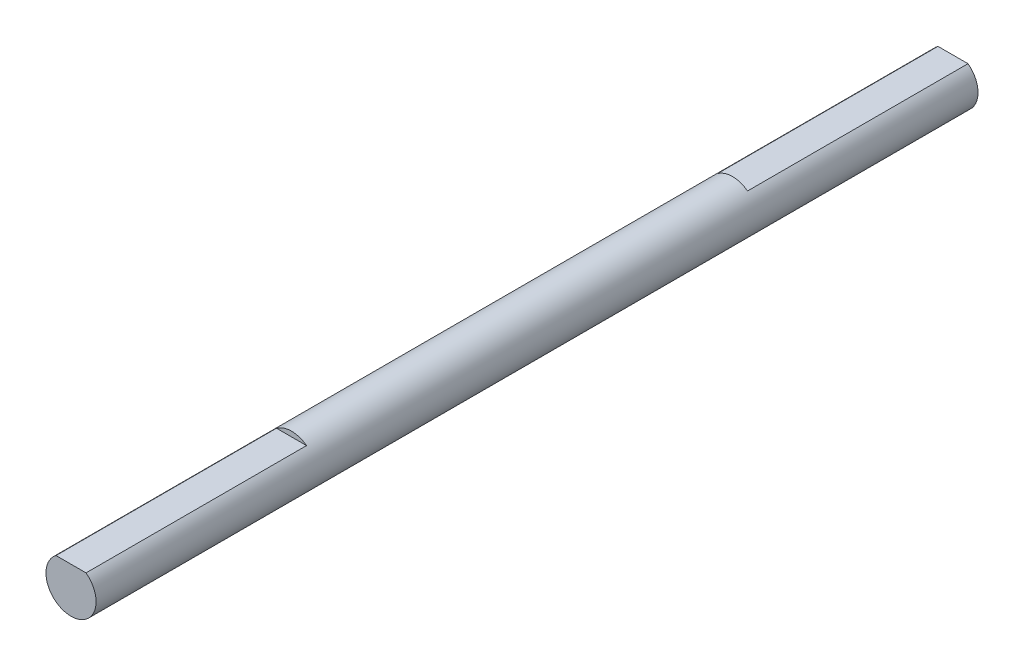
ISO-10303-21;
HEADER;
FILE_DESCRIPTION(('STEP AP214'),'2;1');
FILE_NAME('part.step','',(''),(''),'','','');
FILE_SCHEMA(('AUTOMOTIVE_DESIGN { 1 0 10303 214 1 1 1 1 }'));
ENDSEC;
DATA;
#1=APPLICATION_CONTEXT('core data for automotive mechanical design processes');
#2=APPLICATION_PROTOCOL_DEFINITION('international standard','automotive_design',2000,#1);
#3=PRODUCT_CONTEXT('',#1,'mechanical');
#4=PRODUCT('Part','Part','',(#3));
#5=PRODUCT_RELATED_PRODUCT_CATEGORY('part','',(#4));
#6=PRODUCT_DEFINITION_FORMATION('','',#4);
#7=PRODUCT_DEFINITION_CONTEXT('part definition',#1,'design');
#8=PRODUCT_DEFINITION('design','',#6,#7);
#9=PRODUCT_DEFINITION_SHAPE('','',#8);
#10=(LENGTH_UNIT() NAMED_UNIT(*) SI_UNIT(.MILLI.,.METRE.));
#11=(NAMED_UNIT(*) PLANE_ANGLE_UNIT() SI_UNIT($,.RADIAN.));
#12=(NAMED_UNIT(*) SI_UNIT($,.STERADIAN.) SOLID_ANGLE_UNIT());
#13=UNCERTAINTY_MEASURE_WITH_UNIT(LENGTH_MEASURE(1.E-05),#10,'distance_accuracy_value','');
#14=(GEOMETRIC_REPRESENTATION_CONTEXT(3) GLOBAL_UNCERTAINTY_ASSIGNED_CONTEXT((#13)) GLOBAL_UNIT_ASSIGNED_CONTEXT((#10,
#11,#12)) REPRESENTATION_CONTEXT('',''));
#15=CARTESIAN_POINT('',(0.,0.,0.));
#16=DIRECTION('',(0.,0.,1.));
#17=DIRECTION('',(1.,0.,0.));
#18=AXIS2_PLACEMENT_3D('',#15,#16,#17);
#19=CARTESIAN_POINT('',(0.,0.,88.));
#20=DIRECTION('',(0.,0.,-1.));
#21=DIRECTION('',(-1.,0.,0.));
#22=AXIS2_PLACEMENT_3D('',#19,#20,#21);
#23=CYLINDRICAL_SURFACE('',#22,2.5);
#24=CARTESIAN_POINT('',(0.,0.,22.));
#25=DIRECTION('',(0.,0.,-1.));
#26=DIRECTION('',(1.,0.,0.));
#27=AXIS2_PLACEMENT_3D('',#24,#25,#26);
#28=CIRCLE('',#27,2.5);
#29=CARTESIAN_POINT('',(-1.5,2.,22.));
#30=VERTEX_POINT('',#29);
#31=CARTESIAN_POINT('',(1.5,2.,22.));
#32=VERTEX_POINT('',#31);
#33=EDGE_CURVE('E106',#30,#32,#28,.T.);
#34=ORIENTED_EDGE('',*,*,#33,.F.);
#35=DIRECTION('',(0.,0.,-1.));
#36=VECTOR('',#35,1.);
#37=CARTESIAN_POINT('',(-1.5,2.,22.));
#38=LINE('',#37,#36);
#39=CARTESIAN_POINT('',(-1.5,2.,0.));
#40=VERTEX_POINT('',#39);
#41=EDGE_CURVE('E115',#30,#40,#38,.T.);
#42=ORIENTED_EDGE('',*,*,#41,.T.);
#43=CARTESIAN_POINT('',(0.,0.,0.));
#44=DIRECTION('',(0.,0.,1.));
#45=DIRECTION('',(1.,0.,0.));
#46=AXIS2_PLACEMENT_3D('',#43,#44,#45);
#47=CIRCLE('',#46,2.5);
#48=CARTESIAN_POINT('',(1.5,2.,0.));
#49=VERTEX_POINT('',#48);
#50=EDGE_CURVE('E46',#40,#49,#47,.T.);
#51=ORIENTED_EDGE('',*,*,#50,.T.);
#52=DIRECTION('',(0.,0.,-1.));
#53=VECTOR('',#52,1.);
#54=CARTESIAN_POINT('',(1.5,2.,22.));
#55=LINE('',#54,#53);
#56=EDGE_CURVE('E66',#32,#49,#55,.T.);
#57=ORIENTED_EDGE('',*,*,#56,.F.);
#58=EDGE_LOOP('',(#34,#42,#51,#57));
#59=FACE_BOUND('',#58,.T.);
#60=DIRECTION('',(0.,0.,1.));
#61=VECTOR('',#60,1.);
#62=CARTESIAN_POINT('',(1.5,2.,66.));
#63=LINE('',#62,#61);
#64=CARTESIAN_POINT('',(1.5,2.,66.));
#65=VERTEX_POINT('',#64);
#66=CARTESIAN_POINT('',(1.5,2.,88.));
#67=VERTEX_POINT('',#66);
#68=EDGE_CURVE('E87',#65,#67,#63,.T.);
#69=ORIENTED_EDGE('',*,*,#68,.T.);
#70=CARTESIAN_POINT('',(0.,0.,88.));
#71=DIRECTION('',(0.,0.,1.));
#72=DIRECTION('',(1.,0.,0.));
#73=AXIS2_PLACEMENT_3D('',#70,#71,#72);
#74=CIRCLE('',#73,2.5);
#75=CARTESIAN_POINT('',(-1.5,2.,88.));
#76=VERTEX_POINT('',#75);
#77=EDGE_CURVE('E11',#76,#67,#74,.T.);
#78=ORIENTED_EDGE('',*,*,#77,.F.);
#79=DIRECTION('',(0.,0.,1.));
#80=VECTOR('',#79,1.);
#81=CARTESIAN_POINT('',(-1.5,2.,66.));
#82=LINE('',#81,#80);
#83=CARTESIAN_POINT('',(-1.5,2.,66.));
#84=VERTEX_POINT('',#83);
#85=EDGE_CURVE('E58',#84,#76,#82,.T.);
#86=ORIENTED_EDGE('',*,*,#85,.F.);
#87=CARTESIAN_POINT('',(0.,0.,66.));
#88=DIRECTION('',(0.,0.,-1.));
#89=DIRECTION('',(1.,0.,0.));
#90=AXIS2_PLACEMENT_3D('',#87,#88,#89);
#91=CIRCLE('',#90,2.5);
#92=EDGE_CURVE('E91',#84,#65,#91,.T.);
#93=ORIENTED_EDGE('',*,*,#92,.T.);
#94=EDGE_LOOP('',(#69,#78,#86,#93));
#95=FACE_BOUND('',#94,.T.);
#96=ADVANCED_FACE('F43',(#59,#95),#23,.T.);
#97=CARTESIAN_POINT('',(0.,0.,88.));
#98=DIRECTION('',(0.,0.,1.));
#99=DIRECTION('',(1.,0.,0.));
#100=AXIS2_PLACEMENT_3D('',#97,#98,#99);
#101=PLANE('',#100);
#102=ORIENTED_EDGE('',*,*,#77,.T.);
#103=DIRECTION('',(-1.,0.,0.));
#104=VECTOR('',#103,1.);
#105=CARTESIAN_POINT('',(-1.5,2.,88.));
#106=LINE('',#105,#104);
#107=EDGE_CURVE('E96',#67,#76,#106,.T.);
#108=ORIENTED_EDGE('',*,*,#107,.T.);
#109=EDGE_LOOP('',(#102,#108));
#110=FACE_BOUND('',#109,.T.);
#111=ADVANCED_FACE('F139',(#110),#101,.T.);
#112=CARTESIAN_POINT('',(0.,0.,0.));
#113=DIRECTION('',(0.,0.,1.));
#114=DIRECTION('',(1.,0.,0.));
#115=AXIS2_PLACEMENT_3D('',#112,#113,#114);
#116=PLANE('',#115);
#117=ORIENTED_EDGE('',*,*,#50,.F.);
#118=DIRECTION('',(-1.,0.,0.));
#119=VECTOR('',#118,1.);
#120=CARTESIAN_POINT('',(-1.5,2.,0.));
#121=LINE('',#120,#119);
#122=EDGE_CURVE('E102',#49,#40,#121,.T.);
#123=ORIENTED_EDGE('',*,*,#122,.F.);
#124=EDGE_LOOP('',(#117,#123));
#125=FACE_BOUND('',#124,.T.);
#126=ADVANCED_FACE('F126',(#125),#116,.F.);
#127=CARTESIAN_POINT('',(-1.5,2.,22.));
#128=DIRECTION('',(0.,-1.,0.));
#129=DIRECTION('',(0.,0.,-1.));
#130=AXIS2_PLACEMENT_3D('',#127,#128,#129);
#131=PLANE('',#130);
#132=ORIENTED_EDGE('',*,*,#122,.T.);
#133=ORIENTED_EDGE('',*,*,#41,.F.);
#134=DIRECTION('',(-1.,0.,0.));
#135=VECTOR('',#134,1.);
#136=CARTESIAN_POINT('',(-1.5,2.,22.));
#137=LINE('',#136,#135);
#138=EDGE_CURVE('E109',#32,#30,#137,.T.);
#139=ORIENTED_EDGE('',*,*,#138,.F.);
#140=ORIENTED_EDGE('',*,*,#56,.T.);
#141=EDGE_LOOP('',(#132,#133,#139,#140));
#142=FACE_BOUND('',#141,.T.);
#143=ADVANCED_FACE('F127',(#142),#131,.F.);
#144=CARTESIAN_POINT('',(0.,0.,22.));
#145=DIRECTION('',(0.,0.,1.));
#146=DIRECTION('',(1.,0.,0.));
#147=AXIS2_PLACEMENT_3D('',#144,#145,#146);
#148=PLANE('',#147);
#149=ORIENTED_EDGE('',*,*,#33,.T.);
#150=ORIENTED_EDGE('',*,*,#138,.T.);
#151=EDGE_LOOP('',(#149,#150));
#152=FACE_BOUND('',#151,.T.);
#153=ADVANCED_FACE('F129',(#152),#148,.F.);
#154=CARTESIAN_POINT('',(-1.5,2.,66.));
#155=DIRECTION('',(0.,1.,0.));
#156=DIRECTION('',(0.,0.,1.));
#157=AXIS2_PLACEMENT_3D('',#154,#155,#156);
#158=PLANE('',#157);
#159=ORIENTED_EDGE('',*,*,#107,.F.);
#160=ORIENTED_EDGE('',*,*,#68,.F.);
#161=DIRECTION('',(-1.,0.,0.));
#162=VECTOR('',#161,1.);
#163=CARTESIAN_POINT('',(-1.5,2.,66.));
#164=LINE('',#163,#162);
#165=EDGE_CURVE('E83',#65,#84,#164,.T.);
#166=ORIENTED_EDGE('',*,*,#165,.T.);
#167=ORIENTED_EDGE('',*,*,#85,.T.);
#168=EDGE_LOOP('',(#159,#160,#166,#167));
#169=FACE_BOUND('',#168,.T.);
#170=ADVANCED_FACE('F85',(#169),#158,.T.);
#171=CARTESIAN_POINT('',(0.,0.,66.));
#172=DIRECTION('',(0.,0.,-1.));
#173=DIRECTION('',(1.,0.,0.));
#174=AXIS2_PLACEMENT_3D('',#171,#172,#173);
#175=PLANE('',#174);
#176=ORIENTED_EDGE('',*,*,#92,.F.);
#177=ORIENTED_EDGE('',*,*,#165,.F.);
#178=EDGE_LOOP('',(#176,#177));
#179=FACE_BOUND('',#178,.T.);
#180=ADVANCED_FACE('F93',(#179),#175,.F.);
#181=CLOSED_SHELL('',(#96,#111,#126,#143,#153,#170,#180));
#182=MANIFOLD_SOLID_BREP('B2',#181);
#183=ADVANCED_BREP_SHAPE_REPRESENTATION('',(#18,#182),#14);
#184=SHAPE_DEFINITION_REPRESENTATION(#9,#183);
ENDSEC;
END-ISO-10303-21;
